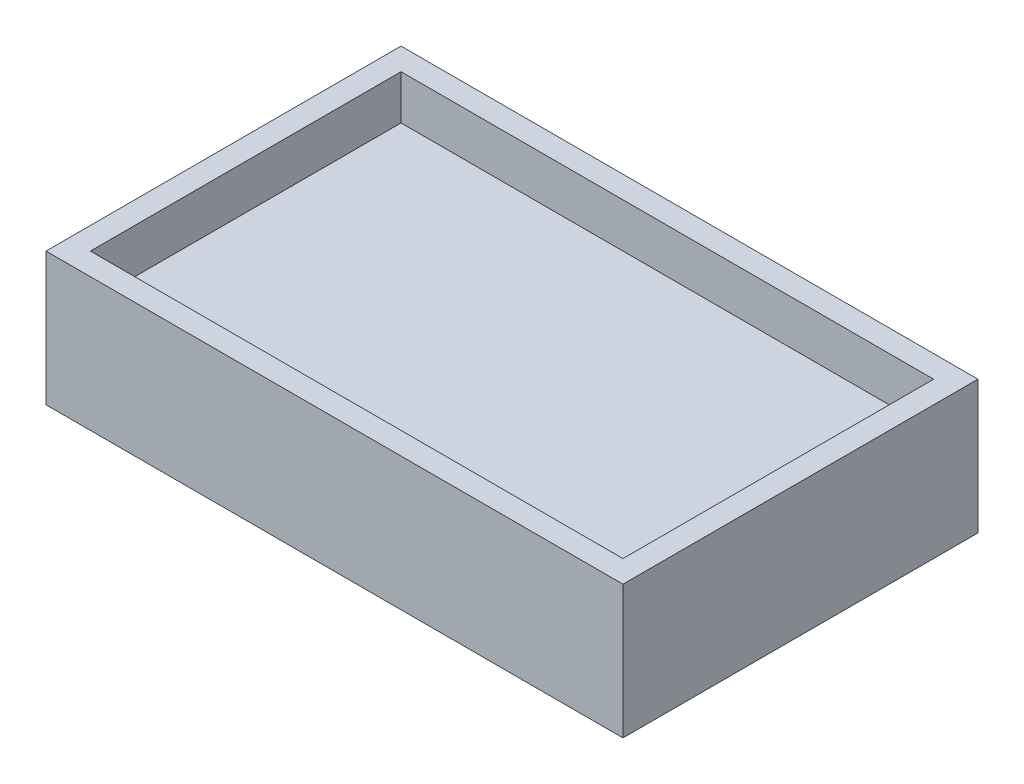
ISO-10303-21;
HEADER;
FILE_DESCRIPTION(('STEP AP214'),'2;1');
FILE_NAME('part.step','',(''),(''),'','','');
FILE_SCHEMA(('AUTOMOTIVE_DESIGN { 1 0 10303 214 1 1 1 1 }'));
ENDSEC;
DATA;
#1=APPLICATION_CONTEXT('core data for automotive mechanical design processes');
#2=APPLICATION_PROTOCOL_DEFINITION('international standard','automotive_design',2000,#1);
#3=PRODUCT_CONTEXT('',#1,'mechanical');
#4=PRODUCT('Part','Part','',(#3));
#5=PRODUCT_RELATED_PRODUCT_CATEGORY('part','',(#4));
#6=PRODUCT_DEFINITION_FORMATION('','',#4);
#7=PRODUCT_DEFINITION_CONTEXT('part definition',#1,'design');
#8=PRODUCT_DEFINITION('design','',#6,#7);
#9=PRODUCT_DEFINITION_SHAPE('','',#8);
#10=(LENGTH_UNIT() NAMED_UNIT(*) SI_UNIT(.MILLI.,.METRE.));
#11=(NAMED_UNIT(*) PLANE_ANGLE_UNIT() SI_UNIT($,.RADIAN.));
#12=(NAMED_UNIT(*) SI_UNIT($,.STERADIAN.) SOLID_ANGLE_UNIT());
#13=UNCERTAINTY_MEASURE_WITH_UNIT(LENGTH_MEASURE(1.E-05),#10,'distance_accuracy_value','');
#14=(GEOMETRIC_REPRESENTATION_CONTEXT(3) GLOBAL_UNCERTAINTY_ASSIGNED_CONTEXT((#13)) GLOBAL_UNIT_ASSIGNED_CONTEXT((#10,
#11,#12)) REPRESENTATION_CONTEXT('',''));
#15=CARTESIAN_POINT('',(0.,0.,0.));
#16=DIRECTION('',(0.,0.,1.));
#17=DIRECTION('',(1.,0.,0.));
#18=AXIS2_PLACEMENT_3D('',#15,#16,#17);
#19=CARTESIAN_POINT('',(65.,25.,-40.));
#20=DIRECTION('',(-1.,0.,0.));
#21=DIRECTION('',(0.,0.,1.));
#22=AXIS2_PLACEMENT_3D('',#19,#20,#21);
#23=PLANE('',#22);
#24=DIRECTION('',(0.,-1.,0.));
#25=VECTOR('',#24,1.);
#26=CARTESIAN_POINT('',(65.,25.,40.));
#27=LINE('',#26,#25);
#28=CARTESIAN_POINT('',(65.,25.,40.));
#29=VERTEX_POINT('',#28);
#30=CARTESIAN_POINT('',(65.,-5.,40.));
#31=VERTEX_POINT('',#30);
#32=EDGE_CURVE('E161',#29,#31,#27,.T.);
#33=ORIENTED_EDGE('',*,*,#32,.T.);
#34=DIRECTION('',(0.,0.,1.));
#35=VECTOR('',#34,1.);
#36=CARTESIAN_POINT('',(65.,-5.,40.));
#37=LINE('',#36,#35);
#38=CARTESIAN_POINT('',(65.,-5.,-40.));
#39=VERTEX_POINT('',#38);
#40=EDGE_CURVE('E115',#39,#31,#37,.T.);
#41=ORIENTED_EDGE('',*,*,#40,.F.);
#42=DIRECTION('',(0.,-1.,0.));
#43=VECTOR('',#42,1.);
#44=CARTESIAN_POINT('',(65.,25.,-40.));
#45=LINE('',#44,#43);
#46=CARTESIAN_POINT('',(65.,25.,-40.));
#47=VERTEX_POINT('',#46);
#48=EDGE_CURVE('E11',#47,#39,#45,.T.);
#49=ORIENTED_EDGE('',*,*,#48,.F.);
#50=DIRECTION('',(0.,0.,-1.));
#51=VECTOR('',#50,1.);
#52=CARTESIAN_POINT('',(65.,25.,-40.));
#53=LINE('',#52,#51);
#54=EDGE_CURVE('E150',#29,#47,#53,.T.);
#55=ORIENTED_EDGE('',*,*,#54,.F.);
#56=EDGE_LOOP('',(#33,#41,#49,#55));
#57=FACE_BOUND('',#56,.T.);
#58=ADVANCED_FACE('F35',(#57),#23,.F.);
#59=CARTESIAN_POINT('',(-65.,25.,-40.));
#60=DIRECTION('',(0.,0.,1.));
#61=DIRECTION('',(1.,0.,0.));
#62=AXIS2_PLACEMENT_3D('',#59,#60,#61);
#63=PLANE('',#62);
#64=ORIENTED_EDGE('',*,*,#48,.T.);
#65=DIRECTION('',(1.,0.,0.));
#66=VECTOR('',#65,1.);
#67=CARTESIAN_POINT('',(65.,-5.,-40.));
#68=LINE('',#67,#66);
#69=CARTESIAN_POINT('',(-65.,-5.,-40.));
#70=VERTEX_POINT('',#69);
#71=EDGE_CURVE('E109',#70,#39,#68,.T.);
#72=ORIENTED_EDGE('',*,*,#71,.F.);
#73=DIRECTION('',(0.,-1.,0.));
#74=VECTOR('',#73,1.);
#75=CARTESIAN_POINT('',(-65.,25.,-40.));
#76=LINE('',#75,#74);
#77=CARTESIAN_POINT('',(-65.,25.,-40.));
#78=VERTEX_POINT('',#77);
#79=EDGE_CURVE('E42',#78,#70,#76,.T.);
#80=ORIENTED_EDGE('',*,*,#79,.F.);
#81=DIRECTION('',(-1.,0.,0.));
#82=VECTOR('',#81,1.);
#83=CARTESIAN_POINT('',(-65.,25.,-40.));
#84=LINE('',#83,#82);
#85=EDGE_CURVE('E157',#47,#78,#84,.T.);
#86=ORIENTED_EDGE('',*,*,#85,.F.);
#87=EDGE_LOOP('',(#64,#72,#80,#86));
#88=FACE_BOUND('',#87,.T.);
#89=ADVANCED_FACE('F110',(#88),#63,.F.);
#90=CARTESIAN_POINT('',(-65.,25.,-40.));
#91=DIRECTION('',(1.,0.,0.));
#92=DIRECTION('',(0.,0.,-1.));
#93=AXIS2_PLACEMENT_3D('',#90,#91,#92);
#94=PLANE('',#93);
#95=ORIENTED_EDGE('',*,*,#79,.T.);
#96=DIRECTION('',(0.,0.,-1.));
#97=VECTOR('',#96,1.);
#98=CARTESIAN_POINT('',(-65.,-5.,40.));
#99=LINE('',#98,#97);
#100=CARTESIAN_POINT('',(-65.,-5.,40.));
#101=VERTEX_POINT('',#100);
#102=EDGE_CURVE('E104',#101,#70,#99,.T.);
#103=ORIENTED_EDGE('',*,*,#102,.F.);
#104=DIRECTION('',(0.,-1.,0.));
#105=VECTOR('',#104,1.);
#106=CARTESIAN_POINT('',(-65.,25.,40.));
#107=LINE('',#106,#105);
#108=CARTESIAN_POINT('',(-65.,25.,40.));
#109=VERTEX_POINT('',#108);
#110=EDGE_CURVE('E107',#109,#101,#107,.T.);
#111=ORIENTED_EDGE('',*,*,#110,.F.);
#112=DIRECTION('',(0.,0.,1.));
#113=VECTOR('',#112,1.);
#114=CARTESIAN_POINT('',(-65.,25.,-40.));
#115=LINE('',#114,#113);
#116=EDGE_CURVE('E105',#78,#109,#115,.T.);
#117=ORIENTED_EDGE('',*,*,#116,.F.);
#118=EDGE_LOOP('',(#95,#103,#111,#117));
#119=FACE_BOUND('',#118,.T.);
#120=ADVANCED_FACE('F101',(#119),#94,.F.);
#121=CARTESIAN_POINT('',(-65.,25.,40.));
#122=DIRECTION('',(0.,0.,-1.));
#123=DIRECTION('',(-1.,0.,0.));
#124=AXIS2_PLACEMENT_3D('',#121,#122,#123);
#125=PLANE('',#124);
#126=ORIENTED_EDGE('',*,*,#110,.T.);
#127=DIRECTION('',(-1.,0.,0.));
#128=VECTOR('',#127,1.);
#129=CARTESIAN_POINT('',(65.,-5.,40.));
#130=LINE('',#129,#128);
#131=EDGE_CURVE('E120',#31,#101,#130,.T.);
#132=ORIENTED_EDGE('',*,*,#131,.F.);
#133=ORIENTED_EDGE('',*,*,#32,.F.);
#134=DIRECTION('',(1.,0.,0.));
#135=VECTOR('',#134,1.);
#136=CARTESIAN_POINT('',(-65.,25.,40.));
#137=LINE('',#136,#135);
#138=EDGE_CURVE('E57',#109,#29,#137,.T.);
#139=ORIENTED_EDGE('',*,*,#138,.F.);
#140=EDGE_LOOP('',(#126,#132,#133,#139));
#141=FACE_BOUND('',#140,.T.);
#142=ADVANCED_FACE('F164',(#141),#125,.F.);
#143=CARTESIAN_POINT('',(0.,25.,0.));
#144=DIRECTION('',(0.,1.,0.));
#145=DIRECTION('',(0.,0.,1.));
#146=AXIS2_PLACEMENT_3D('',#143,#144,#145);
#147=PLANE('',#146);
#148=DIRECTION('',(0.,0.,-1.));
#149=VECTOR('',#148,1.);
#150=CARTESIAN_POINT('',(60.,25.,-35.));
#151=LINE('',#150,#149);
#152=CARTESIAN_POINT('',(60.,25.,35.));
#153=VERTEX_POINT('',#152);
#154=CARTESIAN_POINT('',(60.,25.,-35.));
#155=VERTEX_POINT('',#154);
#156=EDGE_CURVE('E49',#153,#155,#151,.T.);
#157=ORIENTED_EDGE('',*,*,#156,.F.);
#158=DIRECTION('',(1.,0.,0.));
#159=VECTOR('',#158,1.);
#160=CARTESIAN_POINT('',(-60.,25.,35.));
#161=LINE('',#160,#159);
#162=CARTESIAN_POINT('',(-60.,25.,35.));
#163=VERTEX_POINT('',#162);
#164=EDGE_CURVE('E129',#163,#153,#161,.T.);
#165=ORIENTED_EDGE('',*,*,#164,.F.);
#166=DIRECTION('',(0.,0.,1.));
#167=VECTOR('',#166,1.);
#168=CARTESIAN_POINT('',(-60.,25.,-35.));
#169=LINE('',#168,#167);
#170=CARTESIAN_POINT('',(-60.,25.,-35.));
#171=VERTEX_POINT('',#170);
#172=EDGE_CURVE('E143',#171,#163,#169,.T.);
#173=ORIENTED_EDGE('',*,*,#172,.F.);
#174=DIRECTION('',(-1.,0.,0.));
#175=VECTOR('',#174,1.);
#176=CARTESIAN_POINT('',(-60.,25.,-35.));
#177=LINE('',#176,#175);
#178=EDGE_CURVE('E140',#155,#171,#177,.T.);
#179=ORIENTED_EDGE('',*,*,#178,.F.);
#180=EDGE_LOOP('',(#157,#165,#173,#179));
#181=FACE_BOUND('',#180,.T.);
#182=ORIENTED_EDGE('',*,*,#54,.T.);
#183=ORIENTED_EDGE('',*,*,#85,.T.);
#184=ORIENTED_EDGE('',*,*,#116,.T.);
#185=ORIENTED_EDGE('',*,*,#138,.T.);
#186=EDGE_LOOP('',(#182,#183,#184,#185));
#187=FACE_BOUND('',#186,.T.);
#188=ADVANCED_FACE('F167',(#181,#187),#147,.T.);
#189=CARTESIAN_POINT('',(60.,15.,-35.));
#190=DIRECTION('',(1.,0.,0.));
#191=DIRECTION('',(0.,0.,-1.));
#192=AXIS2_PLACEMENT_3D('',#189,#190,#191);
#193=PLANE('',#192);
#194=ORIENTED_EDGE('',*,*,#156,.T.);
#195=DIRECTION('',(0.,1.,0.));
#196=VECTOR('',#195,1.);
#197=CARTESIAN_POINT('',(60.,15.,-35.));
#198=LINE('',#197,#196);
#199=CARTESIAN_POINT('',(60.,15.,-35.));
#200=VERTEX_POINT('',#199);
#201=EDGE_CURVE('E138',#200,#155,#198,.T.);
#202=ORIENTED_EDGE('',*,*,#201,.F.);
#203=DIRECTION('',(0.,0.,-1.));
#204=VECTOR('',#203,1.);
#205=CARTESIAN_POINT('',(60.,15.,-35.));
#206=LINE('',#205,#204);
#207=CARTESIAN_POINT('',(60.,15.,35.));
#208=VERTEX_POINT('',#207);
#209=EDGE_CURVE('E125',#208,#200,#206,.T.);
#210=ORIENTED_EDGE('',*,*,#209,.F.);
#211=DIRECTION('',(0.,1.,0.));
#212=VECTOR('',#211,1.);
#213=CARTESIAN_POINT('',(60.,15.,35.));
#214=LINE('',#213,#212);
#215=EDGE_CURVE('E148',#208,#153,#214,.T.);
#216=ORIENTED_EDGE('',*,*,#215,.T.);
#217=EDGE_LOOP('',(#194,#202,#210,#216));
#218=FACE_BOUND('',#217,.T.);
#219=ADVANCED_FACE('F169',(#218),#193,.F.);
#220=CARTESIAN_POINT('',(-60.,15.,35.));
#221=DIRECTION('',(0.,0.,1.));
#222=DIRECTION('',(1.,0.,0.));
#223=AXIS2_PLACEMENT_3D('',#220,#221,#222);
#224=PLANE('',#223);
#225=ORIENTED_EDGE('',*,*,#164,.T.);
#226=ORIENTED_EDGE('',*,*,#215,.F.);
#227=DIRECTION('',(1.,0.,0.));
#228=VECTOR('',#227,1.);
#229=CARTESIAN_POINT('',(-60.,15.,35.));
#230=LINE('',#229,#228);
#231=CARTESIAN_POINT('',(-60.,15.,35.));
#232=VERTEX_POINT('',#231);
#233=EDGE_CURVE('E135',#232,#208,#230,.T.);
#234=ORIENTED_EDGE('',*,*,#233,.F.);
#235=DIRECTION('',(0.,1.,0.));
#236=VECTOR('',#235,1.);
#237=CARTESIAN_POINT('',(-60.,15.,35.));
#238=LINE('',#237,#236);
#239=EDGE_CURVE('E151',#232,#163,#238,.T.);
#240=ORIENTED_EDGE('',*,*,#239,.T.);
#241=EDGE_LOOP('',(#225,#226,#234,#240));
#242=FACE_BOUND('',#241,.T.);
#243=ADVANCED_FACE('F176',(#242),#224,.F.);
#244=CARTESIAN_POINT('',(-60.,15.,-35.));
#245=DIRECTION('',(-1.,0.,0.));
#246=DIRECTION('',(0.,0.,1.));
#247=AXIS2_PLACEMENT_3D('',#244,#245,#246);
#248=PLANE('',#247);
#249=ORIENTED_EDGE('',*,*,#172,.T.);
#250=ORIENTED_EDGE('',*,*,#239,.F.);
#251=DIRECTION('',(0.,0.,1.));
#252=VECTOR('',#251,1.);
#253=CARTESIAN_POINT('',(-60.,15.,-35.));
#254=LINE('',#253,#252);
#255=CARTESIAN_POINT('',(-60.,15.,-35.));
#256=VERTEX_POINT('',#255);
#257=EDGE_CURVE('E132',#256,#232,#254,.T.);
#258=ORIENTED_EDGE('',*,*,#257,.F.);
#259=DIRECTION('',(0.,1.,0.));
#260=VECTOR('',#259,1.);
#261=CARTESIAN_POINT('',(-60.,15.,-35.));
#262=LINE('',#261,#260);
#263=EDGE_CURVE('E153',#256,#171,#262,.T.);
#264=ORIENTED_EDGE('',*,*,#263,.T.);
#265=EDGE_LOOP('',(#249,#250,#258,#264));
#266=FACE_BOUND('',#265,.T.);
#267=ADVANCED_FACE('F219',(#266),#248,.F.);
#268=CARTESIAN_POINT('',(-60.,15.,-35.));
#269=DIRECTION('',(0.,0.,-1.));
#270=DIRECTION('',(-1.,0.,0.));
#271=AXIS2_PLACEMENT_3D('',#268,#269,#270);
#272=PLANE('',#271);
#273=ORIENTED_EDGE('',*,*,#178,.T.);
#274=ORIENTED_EDGE('',*,*,#263,.F.);
#275=DIRECTION('',(-1.,0.,0.));
#276=VECTOR('',#275,1.);
#277=CARTESIAN_POINT('',(-60.,15.,-35.));
#278=LINE('',#277,#276);
#279=EDGE_CURVE('E128',#200,#256,#278,.T.);
#280=ORIENTED_EDGE('',*,*,#279,.F.);
#281=ORIENTED_EDGE('',*,*,#201,.T.);
#282=EDGE_LOOP('',(#273,#274,#280,#281));
#283=FACE_BOUND('',#282,.T.);
#284=ADVANCED_FACE('F211',(#283),#272,.F.);
#285=CARTESIAN_POINT('',(0.,15.,0.));
#286=DIRECTION('',(0.,1.,0.));
#287=DIRECTION('',(0.,0.,1.));
#288=AXIS2_PLACEMENT_3D('',#285,#286,#287);
#289=PLANE('',#288);
#290=ORIENTED_EDGE('',*,*,#209,.T.);
#291=ORIENTED_EDGE('',*,*,#279,.T.);
#292=ORIENTED_EDGE('',*,*,#257,.T.);
#293=ORIENTED_EDGE('',*,*,#233,.T.);
#294=EDGE_LOOP('',(#290,#291,#292,#293));
#295=FACE_BOUND('',#294,.T.);
#296=ADVANCED_FACE('F202',(#295),#289,.T.);
#297=CARTESIAN_POINT('',(0.,-5.,0.));
#298=DIRECTION('',(0.,1.,0.));
#299=DIRECTION('',(0.,0.,1.));
#300=AXIS2_PLACEMENT_3D('',#297,#298,#299);
#301=PLANE('',#300);
#302=ORIENTED_EDGE('',*,*,#102,.T.);
#303=ORIENTED_EDGE('',*,*,#71,.T.);
#304=ORIENTED_EDGE('',*,*,#40,.T.);
#305=ORIENTED_EDGE('',*,*,#131,.T.);
#306=EDGE_LOOP('',(#302,#303,#304,#305));
#307=FACE_BOUND('',#306,.T.);
#308=ADVANCED_FACE('F118',(#307),#301,.F.);
#309=CLOSED_SHELL('',(#58,#89,#120,#142,#188,#219,#243,#267,#284,#296,#308));
#310=MANIFOLD_SOLID_BREP('B2',#309);
#311=ADVANCED_BREP_SHAPE_REPRESENTATION('',(#18,#310),#14);
#312=SHAPE_DEFINITION_REPRESENTATION(#9,#311);
ENDSEC;
END-ISO-10303-21;
